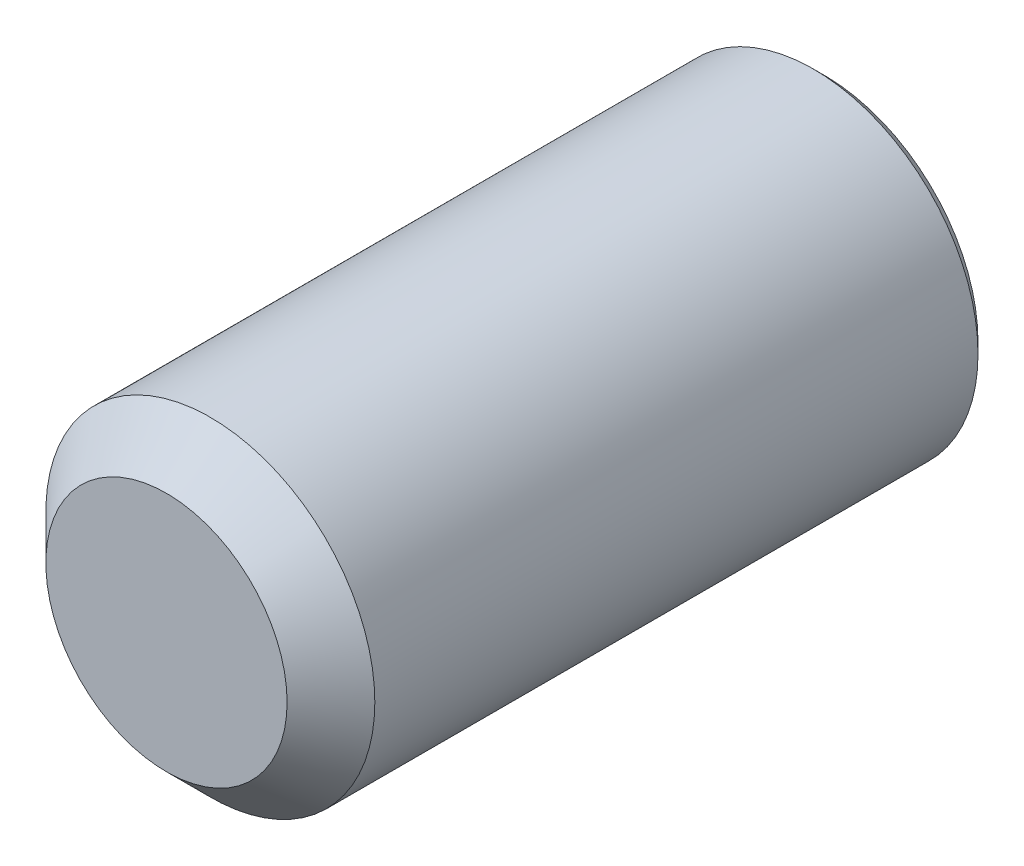
ISO-10303-21;
HEADER;
FILE_DESCRIPTION(('STEP AP214'),'2;1');
FILE_NAME('part.step','',(''),(''),'','','');
FILE_SCHEMA(('AUTOMOTIVE_DESIGN { 1 0 10303 214 1 1 1 1 }'));
ENDSEC;
DATA;
#1=APPLICATION_CONTEXT('core data for automotive mechanical design processes');
#2=APPLICATION_PROTOCOL_DEFINITION('international standard','automotive_design',2000,#1);
#3=PRODUCT_CONTEXT('',#1,'mechanical');
#4=PRODUCT('Part','Part','',(#3));
#5=PRODUCT_RELATED_PRODUCT_CATEGORY('part','',(#4));
#6=PRODUCT_DEFINITION_FORMATION('','',#4);
#7=PRODUCT_DEFINITION_CONTEXT('part definition',#1,'design');
#8=PRODUCT_DEFINITION('design','',#6,#7);
#9=PRODUCT_DEFINITION_SHAPE('','',#8);
#10=(LENGTH_UNIT() NAMED_UNIT(*) SI_UNIT(.MILLI.,.METRE.));
#11=(NAMED_UNIT(*) PLANE_ANGLE_UNIT() SI_UNIT($,.RADIAN.));
#12=(NAMED_UNIT(*) SI_UNIT($,.STERADIAN.) SOLID_ANGLE_UNIT());
#13=UNCERTAINTY_MEASURE_WITH_UNIT(LENGTH_MEASURE(1.E-05),#10,'distance_accuracy_value','');
#14=(GEOMETRIC_REPRESENTATION_CONTEXT(3) GLOBAL_UNCERTAINTY_ASSIGNED_CONTEXT((#13)) GLOBAL_UNIT_ASSIGNED_CONTEXT((#10,
#11,#12)) REPRESENTATION_CONTEXT('',''));
#15=CARTESIAN_POINT('',(0.,0.,0.));
#16=DIRECTION('',(0.,0.,1.));
#17=DIRECTION('',(1.,0.,0.));
#18=AXIS2_PLACEMENT_3D('',#15,#16,#17);
#19=CARTESIAN_POINT('',(0.,0.,6.));
#20=DIRECTION('',(0.,0.,-1.));
#21=DIRECTION('',(-1.,0.,0.));
#22=AXIS2_PLACEMENT_3D('',#19,#20,#21);
#23=CYLINDRICAL_SURFACE('',#22,1.5);
#24=CARTESIAN_POINT('',(0.,0.,0.100000000000001));
#25=DIRECTION('',(0.,0.,1.));
#26=DIRECTION('',(1.,0.,0.));
#27=AXIS2_PLACEMENT_3D('',#24,#25,#26);
#28=CIRCLE('',#27,1.5);
#29=CARTESIAN_POINT('',(1.5,0.,0.100000000000001));
#30=VERTEX_POINT('',#29);
#31=EDGE_CURVE('E180',#30,#30,#28,.T.);
#32=ORIENTED_EDGE('',*,*,#31,.T.);
#33=EDGE_LOOP('',(#32));
#34=FACE_BOUND('',#33,.T.);
#35=CARTESIAN_POINT('',(0.,0.,5.6));
#36=DIRECTION('',(0.,0.,1.));
#37=DIRECTION('',(1.,0.,0.));
#38=AXIS2_PLACEMENT_3D('',#35,#36,#37);
#39=CIRCLE('',#38,1.5);
#40=CARTESIAN_POINT('',(1.5,0.,5.6));
#41=VERTEX_POINT('',#40);
#42=EDGE_CURVE('E145',#41,#41,#39,.F.);
#43=ORIENTED_EDGE('',*,*,#42,.T.);
#44=EDGE_LOOP('',(#43));
#45=FACE_BOUND('',#44,.T.);
#46=ADVANCED_FACE('F34',(#34,#45),#23,.T.);
#47=CARTESIAN_POINT('',(0.,0.,6.));
#48=DIRECTION('',(0.,0.,1.));
#49=DIRECTION('',(1.,0.,0.));
#50=AXIS2_PLACEMENT_3D('',#47,#48,#49);
#51=PLANE('',#50);
#52=CARTESIAN_POINT('',(0.,0.,6.));
#53=DIRECTION('',(0.,0.,1.));
#54=DIRECTION('',(1.,0.,0.));
#55=AXIS2_PLACEMENT_3D('',#52,#53,#54);
#56=CIRCLE('',#55,1.1);
#57=CARTESIAN_POINT('',(1.1,0.,6.));
#58=VERTEX_POINT('',#57);
#59=EDGE_CURVE('E255',#58,#58,#56,.T.);
#60=ORIENTED_EDGE('',*,*,#59,.T.);
#61=EDGE_LOOP('',(#60));
#62=FACE_BOUND('',#61,.T.);
#63=ADVANCED_FACE('F302',(#62),#51,.T.);
#64=CARTESIAN_POINT('',(0.,0.,0.));
#65=DIRECTION('',(0.,0.,1.));
#66=DIRECTION('',(1.,0.,0.));
#67=AXIS2_PLACEMENT_3D('',#64,#65,#66);
#68=PLANE('',#67);
#69=CARTESIAN_POINT('',(0.,0.,0.));
#70=DIRECTION('',(0.,0.,1.));
#71=DIRECTION('',(1.,0.,0.));
#72=AXIS2_PLACEMENT_3D('',#69,#70,#71);
#73=CIRCLE('',#72,1.4);
#74=CARTESIAN_POINT('',(1.4,0.,0.));
#75=VERTEX_POINT('',#74);
#76=EDGE_CURVE('E11',#75,#75,#73,.F.);
#77=ORIENTED_EDGE('',*,*,#76,.T.);
#78=EDGE_LOOP('',(#77));
#79=FACE_BOUND('',#78,.T.);
#80=DIRECTION('',(0.420629629697697,0.907232447953874,0.));
#81=VECTOR('',#80,1.);
#82=CARTESIAN_POINT('',(0.771147580760793,-0.357535185243043,0.));
#83=LINE('',#82,#81);
#84=CARTESIAN_POINT('',(0.56472454531596,-0.802757448580215,0.));
#85=VERTEX_POINT('',#84);
#86=CARTESIAN_POINT('',(0.977570616205627,0.0876870780941302,0.));
#87=VERTEX_POINT('',#86);
#88=EDGE_CURVE('E51',#85,#87,#83,.T.);
#89=ORIENTED_EDGE('',*,*,#88,.T.);
#90=DIRECTION('',(-0.57537153221675,0.817892168879583,0.));
#91=VECTOR('',#90,1.);
#92=CARTESIAN_POINT('',(0.695208343547646,0.489065802384238,0.));
#93=LINE('',#92,#91);
#94=CARTESIAN_POINT('',(0.412846070889666,0.890444526674346,0.));
#95=VERTEX_POINT('',#94);
#96=EDGE_CURVE('E43',#87,#95,#93,.T.);
#97=ORIENTED_EDGE('',*,*,#96,.T.);
#98=DIRECTION('',(-0.996001161914447,-0.0893402790742906,0.));
#99=VECTOR('',#98,1.);
#100=CARTESIAN_POINT('',(-0.0759392372131471,0.846600987627281,0.));
#101=LINE('',#100,#99);
#102=CARTESIAN_POINT('',(-0.56472454531596,0.802757448580215,0.));
#103=VERTEX_POINT('',#102);
#104=EDGE_CURVE('E183',#95,#103,#101,.T.);
#105=ORIENTED_EDGE('',*,*,#104,.T.);
#106=DIRECTION('',(-0.420629629697697,-0.907232447953874,0.));
#107=VECTOR('',#106,1.);
#108=CARTESIAN_POINT('',(-0.771147580760793,0.357535185243042,0.));
#109=LINE('',#108,#107);
#110=CARTESIAN_POINT('',(-0.977570616205627,-0.0876870780941304,0.));
#111=VERTEX_POINT('',#110);
#112=EDGE_CURVE('E185',#103,#111,#109,.T.);
#113=ORIENTED_EDGE('',*,*,#112,.T.);
#114=DIRECTION('',(0.57537153221675,-0.817892168879584,0.));
#115=VECTOR('',#114,1.);
#116=CARTESIAN_POINT('',(-0.695208343547647,-0.489065802384238,0.));
#117=LINE('',#116,#115);
#118=CARTESIAN_POINT('',(-0.412846070889666,-0.890444526674346,0.));
#119=VERTEX_POINT('',#118);
#120=EDGE_CURVE('E187',#111,#119,#117,.T.);
#121=ORIENTED_EDGE('',*,*,#120,.T.);
#122=DIRECTION('',(0.996001161914447,0.0893402790742904,0.));
#123=VECTOR('',#122,1.);
#124=CARTESIAN_POINT('',(0.075939237213147,-0.846600987627281,0.));
#125=LINE('',#124,#123);
#126=EDGE_CURVE('E56',#119,#85,#125,.T.);
#127=ORIENTED_EDGE('',*,*,#126,.T.);
#128=EDGE_LOOP('',(#89,#97,#105,#113,#121,#127));
#129=FACE_BOUND('',#128,.T.);
#130=ADVANCED_FACE('F228',(#79,#129),#68,.F.);
#131=CARTESIAN_POINT('',(0.,0.,6.));
#132=DIRECTION('',(0.,0.,-1.));
#133=DIRECTION('',(-1.,0.,0.));
#134=AXIS2_PLACEMENT_3D('',#131,#132,#133);
#135=CONICAL_SURFACE('',#134,1.1,0.785398163397446);
#136=ORIENTED_EDGE('',*,*,#42,.F.);
#137=EDGE_LOOP('',(#136));
#138=FACE_BOUND('',#137,.T.);
#139=ORIENTED_EDGE('',*,*,#59,.F.);
#140=EDGE_LOOP('',(#139));
#141=FACE_BOUND('',#140,.T.);
#142=ADVANCED_FACE('F313',(#138,#141),#135,.T.);
#143=CARTESIAN_POINT('',(-0.862562308416729,-0.0773709512595268,1.2));
#144=DIRECTION('',(-0.907232447953874,0.420629629697697,0.));
#145=DIRECTION('',(-0.420629629697697,-0.907232447953874,0.));
#146=AXIS2_PLACEMENT_3D('',#143,#144,#145);
#147=PLANE('',#146);
#148=DIRECTION('',(0.,0.,-1.));
#149=VECTOR('',#148,1.);
#150=CARTESIAN_POINT('',(-0.498286363514082,0.708315395806072,1.2));
#151=LINE('',#150,#149);
#152=CARTESIAN_POINT('',(-0.498286363514082,0.708315395806072,1.1));
#153=VERTEX_POINT('',#152);
#154=CARTESIAN_POINT('',(-0.498286363514082,0.708315395806072,0.100000000000001));
#155=VERTEX_POINT('',#154);
#156=EDGE_CURVE('E203',#153,#155,#151,.T.);
#157=ORIENTED_EDGE('',*,*,#156,.F.);
#158=DIRECTION('',(-0.420629629697697,-0.907232447953874,0.));
#159=VECTOR('',#158,1.);
#160=CARTESIAN_POINT('',(-0.862562308416729,-0.0773709512595268,1.1));
#161=LINE('',#160,#159);
#162=CARTESIAN_POINT('',(-0.862562308416729,-0.0773709512595268,1.1));
#163=VERTEX_POINT('',#162);
#164=EDGE_CURVE('E178',#153,#163,#161,.T.);
#165=ORIENTED_EDGE('',*,*,#164,.T.);
#166=DIRECTION('',(0.,0.,-1.));
#167=VECTOR('',#166,1.);
#168=CARTESIAN_POINT('',(-0.862562308416729,-0.0773709512595268,1.2));
#169=LINE('',#168,#167);
#170=CARTESIAN_POINT('',(-0.862562308416729,-0.0773709512595268,0.100000000000001));
#171=VERTEX_POINT('',#170);
#172=EDGE_CURVE('E258',#163,#171,#169,.T.);
#173=ORIENTED_EDGE('',*,*,#172,.T.);
#174=DIRECTION('',(0.420629629697697,0.907232447953874,0.));
#175=VECTOR('',#174,1.);
#176=CARTESIAN_POINT('',(-0.862562308416729,-0.0773709512595268,0.100000000000001));
#177=LINE('',#176,#175);
#178=EDGE_CURVE('E176',#171,#155,#177,.T.);
#179=ORIENTED_EDGE('',*,*,#178,.T.);
#180=EDGE_LOOP('',(#157,#165,#173,#179));
#181=FACE_BOUND('',#180,.T.);
#182=ADVANCED_FACE('F316',(#181),#147,.F.);
#183=CARTESIAN_POINT('',(-0.364275944902647,-0.785686347065598,1.2));
#184=DIRECTION('',(-0.817892168879584,-0.57537153221675,0.));
#185=DIRECTION('',(0.57537153221675,-0.817892168879584,0.));
#186=AXIS2_PLACEMENT_3D('',#183,#184,#185);
#187=PLANE('',#186);
#188=ORIENTED_EDGE('',*,*,#172,.F.);
#189=DIRECTION('',(0.57537153221675,-0.817892168879584,0.));
#190=VECTOR('',#189,1.);
#191=CARTESIAN_POINT('',(-0.364275944902647,-0.785686347065598,1.1));
#192=LINE('',#191,#190);
#193=CARTESIAN_POINT('',(-0.364275944902647,-0.785686347065598,1.1));
#194=VERTEX_POINT('',#193);
#195=EDGE_CURVE('E132',#163,#194,#192,.T.);
#196=ORIENTED_EDGE('',*,*,#195,.T.);
#197=DIRECTION('',(0.,0.,-1.));
#198=VECTOR('',#197,1.);
#199=CARTESIAN_POINT('',(-0.364275944902647,-0.785686347065598,1.2));
#200=LINE('',#199,#198);
#201=CARTESIAN_POINT('',(-0.364275944902647,-0.785686347065598,0.100000000000001));
#202=VERTEX_POINT('',#201);
#203=EDGE_CURVE('E281',#194,#202,#200,.T.);
#204=ORIENTED_EDGE('',*,*,#203,.T.);
#205=DIRECTION('',(-0.57537153221675,0.817892168879584,0.));
#206=VECTOR('',#205,1.);
#207=CARTESIAN_POINT('',(-0.364275944902647,-0.785686347065598,0.100000000000001));
#208=LINE('',#207,#206);
#209=EDGE_CURVE('E151',#202,#171,#208,.T.);
#210=ORIENTED_EDGE('',*,*,#209,.T.);
#211=EDGE_LOOP('',(#188,#196,#204,#210));
#212=FACE_BOUND('',#211,.T.);
#213=ADVANCED_FACE('F280',(#212),#187,.F.);
#214=CARTESIAN_POINT('',(0.498286363514082,-0.708315395806072,1.2));
#215=DIRECTION('',(0.0893402790742904,-0.996001161914447,0.));
#216=DIRECTION('',(0.996001161914447,0.0893402790742904,0.));
#217=AXIS2_PLACEMENT_3D('',#214,#215,#216);
#218=PLANE('',#217);
#219=ORIENTED_EDGE('',*,*,#203,.F.);
#220=DIRECTION('',(0.996001161914447,0.0893402790742904,0.));
#221=VECTOR('',#220,1.);
#222=CARTESIAN_POINT('',(0.498286363514082,-0.708315395806072,1.1));
#223=LINE('',#222,#221);
#224=CARTESIAN_POINT('',(0.498286363514082,-0.708315395806072,1.1));
#225=VERTEX_POINT('',#224);
#226=EDGE_CURVE('E161',#194,#225,#223,.T.);
#227=ORIENTED_EDGE('',*,*,#226,.T.);
#228=DIRECTION('',(0.,0.,-1.));
#229=VECTOR('',#228,1.);
#230=CARTESIAN_POINT('',(0.498286363514082,-0.708315395806072,1.2));
#231=LINE('',#230,#229);
#232=CARTESIAN_POINT('',(0.498286363514082,-0.708315395806072,0.100000000000001));
#233=VERTEX_POINT('',#232);
#234=EDGE_CURVE('E250',#225,#233,#231,.T.);
#235=ORIENTED_EDGE('',*,*,#234,.T.);
#236=DIRECTION('',(-0.996001161914447,-0.0893402790742904,0.));
#237=VECTOR('',#236,1.);
#238=CARTESIAN_POINT('',(0.498286363514082,-0.708315395806072,0.100000000000001));
#239=LINE('',#238,#237);
#240=EDGE_CURVE('E159',#233,#202,#239,.T.);
#241=ORIENTED_EDGE('',*,*,#240,.T.);
#242=EDGE_LOOP('',(#219,#227,#235,#241));
#243=FACE_BOUND('',#242,.T.);
#244=ADVANCED_FACE('F283',(#243),#218,.F.);
#245=CARTESIAN_POINT('',(0.862562308416729,0.0773709512595269,1.2));
#246=DIRECTION('',(0.907232447953874,-0.420629629697697,0.));
#247=DIRECTION('',(0.420629629697697,0.907232447953874,0.));
#248=AXIS2_PLACEMENT_3D('',#245,#246,#247);
#249=PLANE('',#248);
#250=ORIENTED_EDGE('',*,*,#234,.F.);
#251=DIRECTION('',(0.420629629697697,0.907232447953874,0.));
#252=VECTOR('',#251,1.);
#253=CARTESIAN_POINT('',(0.862562308416729,0.0773709512595269,1.1));
#254=LINE('',#253,#252);
#255=CARTESIAN_POINT('',(0.862562308416729,0.0773709512595269,1.1));
#256=VERTEX_POINT('',#255);
#257=EDGE_CURVE('E165',#225,#256,#254,.T.);
#258=ORIENTED_EDGE('',*,*,#257,.T.);
#259=DIRECTION('',(0.,0.,-1.));
#260=VECTOR('',#259,1.);
#261=CARTESIAN_POINT('',(0.862562308416729,0.0773709512595269,1.2));
#262=LINE('',#261,#260);
#263=CARTESIAN_POINT('',(0.862562308416729,0.0773709512595269,0.100000000000001));
#264=VERTEX_POINT('',#263);
#265=EDGE_CURVE('E248',#256,#264,#262,.T.);
#266=ORIENTED_EDGE('',*,*,#265,.T.);
#267=DIRECTION('',(-0.420629629697697,-0.907232447953874,0.));
#268=VECTOR('',#267,1.);
#269=CARTESIAN_POINT('',(0.862562308416729,0.0773709512595269,0.100000000000001));
#270=LINE('',#269,#268);
#271=EDGE_CURVE('E163',#264,#233,#270,.T.);
#272=ORIENTED_EDGE('',*,*,#271,.T.);
#273=EDGE_LOOP('',(#250,#258,#266,#272));
#274=FACE_BOUND('',#273,.T.);
#275=ADVANCED_FACE('F371',(#274),#249,.F.);
#276=CARTESIAN_POINT('',(0.364275944902646,0.785686347065598,1.2));
#277=DIRECTION('',(0.817892168879583,0.57537153221675,0.));
#278=DIRECTION('',(-0.57537153221675,0.817892168879584,0.));
#279=AXIS2_PLACEMENT_3D('',#276,#277,#278);
#280=PLANE('',#279);
#281=ORIENTED_EDGE('',*,*,#265,.F.);
#282=DIRECTION('',(-0.57537153221675,0.817892168879584,0.));
#283=VECTOR('',#282,1.);
#284=CARTESIAN_POINT('',(0.364275944902646,0.785686347065598,1.1));
#285=LINE('',#284,#283);
#286=CARTESIAN_POINT('',(0.364275944902646,0.785686347065598,1.1));
#287=VERTEX_POINT('',#286);
#288=EDGE_CURVE('E170',#256,#287,#285,.T.);
#289=ORIENTED_EDGE('',*,*,#288,.T.);
#290=DIRECTION('',(0.,0.,-1.));
#291=VECTOR('',#290,1.);
#292=CARTESIAN_POINT('',(0.364275944902646,0.785686347065598,1.2));
#293=LINE('',#292,#291);
#294=CARTESIAN_POINT('',(0.364275944902646,0.785686347065598,0.100000000000001));
#295=VERTEX_POINT('',#294);
#296=EDGE_CURVE('E240',#287,#295,#293,.T.);
#297=ORIENTED_EDGE('',*,*,#296,.T.);
#298=DIRECTION('',(0.57537153221675,-0.817892168879584,0.));
#299=VECTOR('',#298,1.);
#300=CARTESIAN_POINT('',(0.364275944902646,0.785686347065598,0.100000000000001));
#301=LINE('',#300,#299);
#302=EDGE_CURVE('E167',#295,#264,#301,.T.);
#303=ORIENTED_EDGE('',*,*,#302,.T.);
#304=EDGE_LOOP('',(#281,#289,#297,#303));
#305=FACE_BOUND('',#304,.T.);
#306=ADVANCED_FACE('F245',(#305),#280,.F.);
#307=CARTESIAN_POINT('',(-0.498286363514082,0.708315395806072,1.2));
#308=DIRECTION('',(-0.0893402790742906,0.996001161914447,0.));
#309=DIRECTION('',(-0.996001161914447,-0.0893402790742906,0.));
#310=AXIS2_PLACEMENT_3D('',#307,#308,#309);
#311=PLANE('',#310);
#312=ORIENTED_EDGE('',*,*,#296,.F.);
#313=DIRECTION('',(-0.996001161914447,-0.0893402790742906,0.));
#314=VECTOR('',#313,1.);
#315=CARTESIAN_POINT('',(-0.498286363514082,0.708315395806072,1.1));
#316=LINE('',#315,#314);
#317=EDGE_CURVE('E174',#287,#153,#316,.T.);
#318=ORIENTED_EDGE('',*,*,#317,.T.);
#319=ORIENTED_EDGE('',*,*,#156,.T.);
#320=DIRECTION('',(0.996001161914447,0.0893402790742906,0.));
#321=VECTOR('',#320,1.);
#322=CARTESIAN_POINT('',(-0.498286363514082,0.708315395806072,0.100000000000001));
#323=LINE('',#322,#321);
#324=EDGE_CURVE('E172',#155,#295,#323,.T.);
#325=ORIENTED_EDGE('',*,*,#324,.T.);
#326=EDGE_LOOP('',(#312,#318,#319,#325));
#327=FACE_BOUND('',#326,.T.);
#328=ADVANCED_FACE('F239',(#327),#311,.F.);
#329=CARTESIAN_POINT('',(0.,0.,1.2));
#330=DIRECTION('',(0.,0.,-1.));
#331=DIRECTION('',(-1.,0.,0.));
#332=AXIS2_PLACEMENT_3D('',#329,#330,#331);
#333=PLANE('',#332);
#334=DIRECTION('',(-0.996001161914447,-0.0893402790742904,0.));
#335=VECTOR('',#334,1.);
#336=CARTESIAN_POINT('',(0.0580711813982886,-0.647400755244389,1.2));
#337=LINE('',#336,#335);
#338=CARTESIAN_POINT('',(0.431848181712203,-0.613873343031927,1.2));
#339=VERTEX_POINT('',#338);
#340=CARTESIAN_POINT('',(-0.315705818915626,-0.68092816745685,1.2));
#341=VERTEX_POINT('',#340);
#342=EDGE_CURVE('E149',#339,#341,#337,.T.);
#343=ORIENTED_EDGE('',*,*,#342,.T.);
#344=DIRECTION('',(-0.57537153221675,0.817892168879584,0.));
#345=VECTOR('',#344,1.);
#346=CARTESIAN_POINT('',(-0.531629909771728,-0.373991495940887,1.2));
#347=LINE('',#346,#345);
#348=CARTESIAN_POINT('',(-0.74755400062783,-0.0670548244249232,1.2));
#349=VERTEX_POINT('',#348);
#350=EDGE_CURVE('E130',#341,#349,#347,.T.);
#351=ORIENTED_EDGE('',*,*,#350,.T.);
#352=DIRECTION('',(0.420629629697697,0.907232447953874,0.));
#353=VECTOR('',#352,1.);
#354=CARTESIAN_POINT('',(-0.589701091170016,0.273409259303502,1.2));
#355=LINE('',#354,#353);
#356=CARTESIAN_POINT('',(-0.431848181712203,0.613873343031927,1.2));
#357=VERTEX_POINT('',#356);
#358=EDGE_CURVE('E138',#349,#357,#355,.T.);
#359=ORIENTED_EDGE('',*,*,#358,.T.);
#360=DIRECTION('',(0.996001161914447,0.0893402790742906,0.));
#361=VECTOR('',#360,1.);
#362=CARTESIAN_POINT('',(-0.0580711813982887,0.647400755244389,1.2));
#363=LINE('',#362,#361);
#364=CARTESIAN_POINT('',(0.315705818915626,0.68092816745685,1.2));
#365=VERTEX_POINT('',#364);
#366=EDGE_CURVE('E144',#357,#365,#363,.T.);
#367=ORIENTED_EDGE('',*,*,#366,.T.);
#368=DIRECTION('',(0.57537153221675,-0.817892168879583,0.));
#369=VECTOR('',#368,1.);
#370=CARTESIAN_POINT('',(0.531629909771728,0.373991495940887,1.2));
#371=LINE('',#370,#369);
#372=CARTESIAN_POINT('',(0.74755400062783,0.067054824424923,1.2));
#373=VERTEX_POINT('',#372);
#374=EDGE_CURVE('E262',#365,#373,#371,.T.);
#375=ORIENTED_EDGE('',*,*,#374,.T.);
#376=DIRECTION('',(-0.420629629697697,-0.907232447953874,0.));
#377=VECTOR('',#376,1.);
#378=CARTESIAN_POINT('',(0.589701091170016,-0.273409259303502,1.2));
#379=LINE('',#378,#377);
#380=EDGE_CURVE('E154',#373,#339,#379,.T.);
#381=ORIENTED_EDGE('',*,*,#380,.T.);
#382=EDGE_LOOP('',(#343,#351,#359,#367,#375,#381));
#383=FACE_BOUND('',#382,.T.);
#384=ADVANCED_FACE('F147',(#383),#333,.T.);
#385=CARTESIAN_POINT('',(0.531629909771728,0.373991495940887,1.2));
#386=DIRECTION('',(0.578337098894122,0.406849112132155,0.707106781186552));
#387=DIRECTION('',(0.57537153221675,-0.817892168879584,0.));
#388=AXIS2_PLACEMENT_3D('',#385,#386,#387);
#389=PLANE('',#388);
#390=DIRECTION('',(-0.317966112641515,-0.685803268175518,0.654653670707972));
#391=VECTOR('',#390,1.);
#392=CARTESIAN_POINT('',(0.270604987641964,0.583652714963013,1.29285714285714));
#393=LINE('',#392,#391);
#394=EDGE_CURVE('E197',#287,#365,#393,.T.);
#395=ORIENTED_EDGE('',*,*,#394,.F.);
#396=ORIENTED_EDGE('',*,*,#288,.F.);
#397=DIRECTION('',(-0.752906108559148,-0.0675349029976238,0.654653670707972));
#398=VECTOR('',#397,1.);
#399=CARTESIAN_POINT('',(0.64076057196671,0.057475563792791,1.29285714285714));
#400=LINE('',#399,#398);
#401=EDGE_CURVE('E200',#373,#256,#400,.F.);
#402=ORIENTED_EDGE('',*,*,#401,.F.);
#403=ORIENTED_EDGE('',*,*,#374,.F.);
#404=EDGE_LOOP('',(#395,#396,#402,#403));
#405=FACE_BOUND('',#404,.T.);
#406=ADVANCED_FACE('F331',(#405),#389,.F.);
#407=CARTESIAN_POINT('',(0.589701091170016,-0.273409259303502,1.2));
#408=DIRECTION('',(0.641510216060652,-0.297430063527226,0.707106781186552));
#409=DIRECTION('',(-0.420629629697697,-0.907232447953874,0.));
#410=AXIS2_PLACEMENT_3D('',#407,#408,#409);
#411=PLANE('',#410);
#412=ORIENTED_EDGE('',*,*,#401,.T.);
#413=ORIENTED_EDGE('',*,*,#257,.F.);
#414=DIRECTION('',(-0.434939995917633,0.618268365177896,0.654653670707972));
#415=VECTOR('',#414,1.);
#416=CARTESIAN_POINT('',(0.370155584324745,-0.526177151170222,1.29285714285714));
#417=LINE('',#416,#415);
#418=EDGE_CURVE('E194',#339,#225,#417,.F.);
#419=ORIENTED_EDGE('',*,*,#418,.F.);
#420=ORIENTED_EDGE('',*,*,#380,.F.);
#421=EDGE_LOOP('',(#412,#413,#419,#420));
#422=FACE_BOUND('',#421,.T.);
#423=ADVANCED_FACE('F269',(#422),#411,.F.);
#424=CARTESIAN_POINT('',(-0.0580711813982887,0.647400755244389,1.2));
#425=DIRECTION('',(-0.0631731171665291,0.704279175659381,0.707106781186552));
#426=DIRECTION('',(0.996001161914447,0.0893402790742906,0.));
#427=AXIS2_PLACEMENT_3D('',#424,#425,#426);
#428=PLANE('',#427);
#429=ORIENTED_EDGE('',*,*,#394,.T.);
#430=ORIENTED_EDGE('',*,*,#366,.F.);
#431=DIRECTION('',(0.434939995917635,-0.618268365177894,0.654653670707972));
#432=VECTOR('',#431,1.);
#433=CARTESIAN_POINT('',(-0.370155584324744,0.526177151170222,1.29285714285714));
#434=LINE('',#433,#432);
#435=EDGE_CURVE('E141',#153,#357,#434,.T.);
#436=ORIENTED_EDGE('',*,*,#435,.F.);
#437=ORIENTED_EDGE('',*,*,#317,.F.);
#438=EDGE_LOOP('',(#429,#430,#436,#437));
#439=FACE_BOUND('',#438,.T.);
#440=ADVANCED_FACE('F325',(#439),#428,.F.);
#441=CARTESIAN_POINT('',(0.0580711813982886,-0.647400755244389,1.2));
#442=DIRECTION('',(0.0631731171665289,-0.70427917565938,0.707106781186553));
#443=DIRECTION('',(-0.996001161914447,-0.0893402790742904,0.));
#444=AXIS2_PLACEMENT_3D('',#441,#442,#443);
#445=PLANE('',#444);
#446=ORIENTED_EDGE('',*,*,#418,.T.);
#447=ORIENTED_EDGE('',*,*,#226,.F.);
#448=DIRECTION('',(0.317966112641514,0.685803268175519,0.654653670707972));
#449=VECTOR('',#448,1.);
#450=CARTESIAN_POINT('',(-0.270604987641965,-0.583652714963013,1.29285714285714));
#451=LINE('',#450,#449);
#452=EDGE_CURVE('E135',#341,#194,#451,.F.);
#453=ORIENTED_EDGE('',*,*,#452,.F.);
#454=ORIENTED_EDGE('',*,*,#342,.F.);
#455=EDGE_LOOP('',(#446,#447,#453,#454));
#456=FACE_BOUND('',#455,.T.);
#457=ADVANCED_FACE('F272',(#456),#445,.F.);
#458=CARTESIAN_POINT('',(-0.589701091170016,0.273409259303502,1.2));
#459=DIRECTION('',(-0.641510216060651,0.297430063527226,0.707106781186553));
#460=DIRECTION('',(0.420629629697697,0.907232447953874,0.));
#461=AXIS2_PLACEMENT_3D('',#458,#459,#460);
#462=PLANE('',#461);
#463=ORIENTED_EDGE('',*,*,#435,.T.);
#464=ORIENTED_EDGE('',*,*,#358,.F.);
#465=DIRECTION('',(-0.752906108559149,-0.0675349029976226,-0.654653670707972));
#466=VECTOR('',#465,1.);
#467=CARTESIAN_POINT('',(-0.640760571966709,-0.0574755637927913,1.29285714285714));
#468=LINE('',#467,#466);
#469=EDGE_CURVE('E126',#163,#349,#468,.F.);
#470=ORIENTED_EDGE('',*,*,#469,.F.);
#471=ORIENTED_EDGE('',*,*,#164,.F.);
#472=EDGE_LOOP('',(#463,#464,#470,#471));
#473=FACE_BOUND('',#472,.T.);
#474=ADVANCED_FACE('F139',(#473),#462,.F.);
#475=CARTESIAN_POINT('',(-0.531629909771728,-0.373991495940887,1.2));
#476=DIRECTION('',(-0.578337098894122,-0.406849112132155,0.707106781186553));
#477=DIRECTION('',(-0.57537153221675,0.817892168879584,0.));
#478=AXIS2_PLACEMENT_3D('',#475,#476,#477);
#479=PLANE('',#478);
#480=ORIENTED_EDGE('',*,*,#452,.T.);
#481=ORIENTED_EDGE('',*,*,#195,.F.);
#482=ORIENTED_EDGE('',*,*,#469,.T.);
#483=ORIENTED_EDGE('',*,*,#350,.F.);
#484=EDGE_LOOP('',(#480,#481,#482,#483));
#485=FACE_BOUND('',#484,.T.);
#486=ADVANCED_FACE('F128',(#485),#479,.F.);
#487=CARTESIAN_POINT('',(0.,0.,0.100000000000001));
#488=DIRECTION('',(0.,0.,1.));
#489=DIRECTION('',(1.,0.,0.));
#490=AXIS2_PLACEMENT_3D('',#487,#488,#489);
#491=CONICAL_SURFACE('',#490,1.5,0.785398163397447);
#492=ORIENTED_EDGE('',*,*,#76,.F.);
#493=EDGE_LOOP('',(#492));
#494=FACE_BOUND('',#493,.T.);
#495=ORIENTED_EDGE('',*,*,#31,.F.);
#496=EDGE_LOOP('',(#495));
#497=FACE_BOUND('',#496,.T.);
#498=ADVANCED_FACE('F320',(#494,#497),#491,.T.);
#499=CARTESIAN_POINT('',(-0.364275944902647,-0.785686347065598,0.100000000000001));
#500=DIRECTION('',(-0.578337098894128,-0.406849112132159,0.707106781186546));
#501=DIRECTION('',(-0.57537153221675,0.817892168879584,0.));
#502=AXIS2_PLACEMENT_3D('',#499,#500,#501);
#503=PLANE('',#502);
#504=DIRECTION('',(-0.317966112641511,-0.685803268175514,-0.654653670707978));
#505=VECTOR('',#504,1.);
#506=CARTESIAN_POINT('',(-0.260197103501892,-0.561204533618286,0.314285714285715));
#507=LINE('',#506,#505);
#508=EDGE_CURVE('E213',#119,#202,#507,.F.);
#509=ORIENTED_EDGE('',*,*,#508,.F.);
#510=ORIENTED_EDGE('',*,*,#120,.F.);
#511=DIRECTION('',(-0.752906108559142,-0.0675349029976221,-0.654653670707979));
#512=VECTOR('',#511,1.);
#513=CARTESIAN_POINT('',(-0.616115934583378,-0.0552649651853767,0.314285714285716));
#514=LINE('',#513,#512);
#515=EDGE_CURVE('E38',#171,#111,#514,.T.);
#516=ORIENTED_EDGE('',*,*,#515,.F.);
#517=ORIENTED_EDGE('',*,*,#209,.F.);
#518=EDGE_LOOP('',(#509,#510,#516,#517));
#519=FACE_BOUND('',#518,.T.);
#520=ADVANCED_FACE('F36',(#519),#503,.F.);
#521=CARTESIAN_POINT('',(-0.862562308416729,-0.0773709512595268,0.100000000000001));
#522=DIRECTION('',(-0.641510216060657,0.297430063527228,0.707106781186546));
#523=DIRECTION('',(0.420629629697697,0.907232447953874,0.));
#524=AXIS2_PLACEMENT_3D('',#521,#522,#523);
#525=PLANE('',#524);
#526=ORIENTED_EDGE('',*,*,#515,.T.);
#527=ORIENTED_EDGE('',*,*,#112,.F.);
#528=DIRECTION('',(-0.43493999591763,0.618268365177891,-0.654653670707978));
#529=VECTOR('',#528,1.);
#530=CARTESIAN_POINT('',(-0.355918831081487,0.505939568432908,0.314285714285716));
#531=LINE('',#530,#529);
#532=EDGE_CURVE('E211',#155,#103,#531,.T.);
#533=ORIENTED_EDGE('',*,*,#532,.F.);
#534=ORIENTED_EDGE('',*,*,#178,.F.);
#535=EDGE_LOOP('',(#526,#527,#533,#534));
#536=FACE_BOUND('',#535,.T.);
#537=ADVANCED_FACE('F223',(#536),#525,.F.);
#538=CARTESIAN_POINT('',(0.498286363514082,-0.708315395806072,0.100000000000001));
#539=DIRECTION('',(0.0631731171665294,-0.704279175659387,0.707106781186547));
#540=DIRECTION('',(-0.996001161914447,-0.0893402790742904,0.));
#541=AXIS2_PLACEMENT_3D('',#538,#539,#540);
#542=PLANE('',#541);
#543=ORIENTED_EDGE('',*,*,#508,.T.);
#544=ORIENTED_EDGE('',*,*,#240,.F.);
#545=DIRECTION('',(0.43493999591763,-0.618268365177891,-0.654653670707978));
#546=VECTOR('',#545,1.);
#547=CARTESIAN_POINT('',(0.355918831081487,-0.505939568432909,0.314285714285716));
#548=LINE('',#547,#546);
#549=EDGE_CURVE('E208',#85,#233,#548,.F.);
#550=ORIENTED_EDGE('',*,*,#549,.F.);
#551=ORIENTED_EDGE('',*,*,#126,.F.);
#552=EDGE_LOOP('',(#543,#544,#550,#551));
#553=FACE_BOUND('',#552,.T.);
#554=ADVANCED_FACE('F287',(#553),#542,.F.);
#555=CARTESIAN_POINT('',(-0.498286363514082,0.708315395806072,0.100000000000001));
#556=DIRECTION('',(-0.0631731171665295,0.704279175659386,0.707106781186547));
#557=DIRECTION('',(0.996001161914447,0.0893402790742906,0.));
#558=AXIS2_PLACEMENT_3D('',#555,#556,#557);
#559=PLANE('',#558);
#560=ORIENTED_EDGE('',*,*,#532,.T.);
#561=ORIENTED_EDGE('',*,*,#104,.F.);
#562=DIRECTION('',(-0.31796611264151,-0.685803268175514,0.654653670707978));
#563=VECTOR('',#562,1.);
#564=CARTESIAN_POINT('',(0.364275944902646,0.785686347065598,0.100000000000001));
#565=LINE('',#564,#563);
#566=EDGE_CURVE('E206',#295,#95,#565,.F.);
#567=ORIENTED_EDGE('',*,*,#566,.F.);
#568=ORIENTED_EDGE('',*,*,#324,.F.);
#569=EDGE_LOOP('',(#560,#561,#567,#568));
#570=FACE_BOUND('',#569,.T.);
#571=ADVANCED_FACE('F232',(#570),#559,.F.);
#572=CARTESIAN_POINT('',(0.862562308416729,0.0773709512595269,0.100000000000001));
#573=DIRECTION('',(0.641510216060657,-0.297430063527228,0.707106781186547));
#574=DIRECTION('',(-0.420629629697697,-0.907232447953874,0.));
#575=AXIS2_PLACEMENT_3D('',#572,#573,#574);
#576=PLANE('',#575);
#577=ORIENTED_EDGE('',*,*,#549,.T.);
#578=ORIENTED_EDGE('',*,*,#271,.F.);
#579=DIRECTION('',(0.752906108559143,0.0675349029976211,-0.654653670707979));
#580=VECTOR('',#579,1.);
#581=CARTESIAN_POINT('',(0.616115934583377,0.0552649651853769,0.314285714285716));
#582=LINE('',#581,#580);
#583=EDGE_CURVE('E204',#87,#264,#582,.F.);
#584=ORIENTED_EDGE('',*,*,#583,.F.);
#585=ORIENTED_EDGE('',*,*,#88,.F.);
#586=EDGE_LOOP('',(#577,#578,#584,#585));
#587=FACE_BOUND('',#586,.T.);
#588=ADVANCED_FACE('F290',(#587),#576,.F.);
#589=CARTESIAN_POINT('',(0.364275944902646,0.785686347065598,0.100000000000001));
#590=DIRECTION('',(0.578337098894128,0.406849112132159,0.707106781186546));
#591=DIRECTION('',(0.57537153221675,-0.817892168879584,0.));
#592=AXIS2_PLACEMENT_3D('',#589,#590,#591);
#593=PLANE('',#592);
#594=ORIENTED_EDGE('',*,*,#566,.T.);
#595=ORIENTED_EDGE('',*,*,#96,.F.);
#596=ORIENTED_EDGE('',*,*,#583,.T.);
#597=ORIENTED_EDGE('',*,*,#302,.F.);
#598=EDGE_LOOP('',(#594,#595,#596,#597));
#599=FACE_BOUND('',#598,.T.);
#600=ADVANCED_FACE('F293',(#599),#593,.F.);
#601=CLOSED_SHELL('',(#46,#63,#130,#142,#182,#213,#244,#275,#306,#328,#384,#406,#423,#440,#457,
#474,#486,#498,#520,#537,#554,#571,#588,#600));
#602=MANIFOLD_SOLID_BREP('B2',#601);
#603=ADVANCED_BREP_SHAPE_REPRESENTATION('',(#18,#602),#14);
#604=SHAPE_DEFINITION_REPRESENTATION(#9,#603);
ENDSEC;
END-ISO-10303-21;
